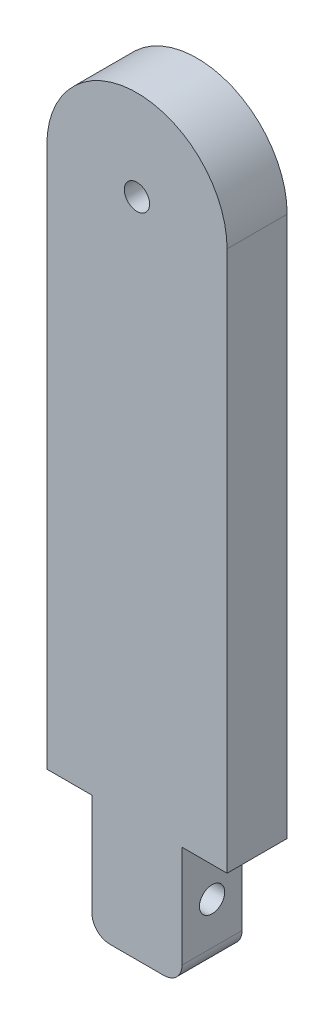
ISO-10303-21;
HEADER;
FILE_DESCRIPTION(('STEP AP214'),'2;1');
FILE_NAME('part.step','',(''),(''),'','','');
FILE_SCHEMA(('AUTOMOTIVE_DESIGN { 1 0 10303 214 1 1 1 1 }'));
ENDSEC;
DATA;
#1=APPLICATION_CONTEXT('core data for automotive mechanical design processes');
#2=APPLICATION_PROTOCOL_DEFINITION('international standard','automotive_design',2000,#1);
#3=PRODUCT_CONTEXT('',#1,'mechanical');
#4=PRODUCT('Part','Part','',(#3));
#5=PRODUCT_RELATED_PRODUCT_CATEGORY('part','',(#4));
#6=PRODUCT_DEFINITION_FORMATION('','',#4);
#7=PRODUCT_DEFINITION_CONTEXT('part definition',#1,'design');
#8=PRODUCT_DEFINITION('design','',#6,#7);
#9=PRODUCT_DEFINITION_SHAPE('','',#8);
#10=(LENGTH_UNIT() NAMED_UNIT(*) SI_UNIT(.MILLI.,.METRE.));
#11=(NAMED_UNIT(*) PLANE_ANGLE_UNIT() SI_UNIT($,.RADIAN.));
#12=(NAMED_UNIT(*) SI_UNIT($,.STERADIAN.) SOLID_ANGLE_UNIT());
#13=UNCERTAINTY_MEASURE_WITH_UNIT(LENGTH_MEASURE(1.E-05),#10,'distance_accuracy_value','');
#14=(GEOMETRIC_REPRESENTATION_CONTEXT(3) GLOBAL_UNCERTAINTY_ASSIGNED_CONTEXT((#13)) GLOBAL_UNIT_ASSIGNED_CONTEXT((#10,
#11,#12)) REPRESENTATION_CONTEXT('',''));
#15=CARTESIAN_POINT('',(0.,0.,0.));
#16=DIRECTION('',(0.,0.,1.));
#17=DIRECTION('',(1.,0.,0.));
#18=AXIS2_PLACEMENT_3D('',#15,#16,#17);
#19=CARTESIAN_POINT('',(15.,110.,0.));
#20=DIRECTION('',(0.,0.,-1.));
#21=DIRECTION('',(-1.,0.,0.));
#22=AXIS2_PLACEMENT_3D('',#19,#20,#21);
#23=CYLINDRICAL_SURFACE('',#22,15.);
#24=DIRECTION('',(0.,0.,-1.));
#25=VECTOR('',#24,1.);
#26=CARTESIAN_POINT('',(30.,110.,10.));
#27=LINE('',#26,#25);
#28=CARTESIAN_POINT('',(30.,110.,0.));
#29=VERTEX_POINT('',#28);
#30=CARTESIAN_POINT('',(30.,110.,10.));
#31=VERTEX_POINT('',#30);
#32=EDGE_CURVE('E196',#29,#31,#27,.F.);
#33=ORIENTED_EDGE('',*,*,#32,.F.);
#34=CARTESIAN_POINT('',(15.,110.,0.));
#35=DIRECTION('',(0.,0.,-1.));
#36=DIRECTION('',(-1.,0.,0.));
#37=AXIS2_PLACEMENT_3D('',#34,#35,#36);
#38=CIRCLE('',#37,15.);
#39=CARTESIAN_POINT('',(0.,110.,0.));
#40=VERTEX_POINT('',#39);
#41=EDGE_CURVE('E51',#40,#29,#38,.T.);
#42=ORIENTED_EDGE('',*,*,#41,.F.);
#43=DIRECTION('',(0.,0.,-1.));
#44=VECTOR('',#43,1.);
#45=CARTESIAN_POINT('',(0.,110.,10.));
#46=LINE('',#45,#44);
#47=CARTESIAN_POINT('',(0.,110.,10.));
#48=VERTEX_POINT('',#47);
#49=EDGE_CURVE('E122',#48,#40,#46,.T.);
#50=ORIENTED_EDGE('',*,*,#49,.F.);
#51=CARTESIAN_POINT('',(15.,110.,10.));
#52=DIRECTION('',(0.,0.,-1.));
#53=DIRECTION('',(-1.,0.,0.));
#54=AXIS2_PLACEMENT_3D('',#51,#52,#53);
#55=CIRCLE('',#54,15.);
#56=EDGE_CURVE('E11',#31,#48,#55,.F.);
#57=ORIENTED_EDGE('',*,*,#56,.F.);
#58=EDGE_LOOP('',(#33,#42,#50,#57));
#59=FACE_BOUND('',#58,.T.);
#60=ADVANCED_FACE('F43',(#59),#23,.T.);
#61=CARTESIAN_POINT('',(0.,0.,10.));
#62=DIRECTION('',(1.,0.,0.));
#63=DIRECTION('',(0.,0.,-1.));
#64=AXIS2_PLACEMENT_3D('',#61,#62,#63);
#65=PLANE('',#64);
#66=DIRECTION('',(0.,-1.,0.));
#67=VECTOR('',#66,1.);
#68=CARTESIAN_POINT('',(0.,0.,10.));
#69=LINE('',#68,#67);
#70=CARTESIAN_POINT('',(0.,20.,10.));
#71=VERTEX_POINT('',#70);
#72=EDGE_CURVE('E166',#48,#71,#69,.T.);
#73=ORIENTED_EDGE('',*,*,#72,.F.);
#74=ORIENTED_EDGE('',*,*,#49,.T.);
#75=DIRECTION('',(0.,-1.,0.));
#76=VECTOR('',#75,1.);
#77=CARTESIAN_POINT('',(0.,0.,0.));
#78=LINE('',#77,#76);
#79=CARTESIAN_POINT('',(0.,20.,0.));
#80=VERTEX_POINT('',#79);
#81=EDGE_CURVE('E117',#40,#80,#78,.T.);
#82=ORIENTED_EDGE('',*,*,#81,.T.);
#83=DIRECTION('',(0.,0.,1.));
#84=VECTOR('',#83,1.);
#85=CARTESIAN_POINT('',(0.,20.,0.));
#86=LINE('',#85,#84);
#87=EDGE_CURVE('E121',#80,#71,#86,.T.);
#88=ORIENTED_EDGE('',*,*,#87,.T.);
#89=EDGE_LOOP('',(#73,#74,#82,#88));
#90=FACE_BOUND('',#89,.T.);
#91=ADVANCED_FACE('F120',(#90),#65,.F.);
#92=CARTESIAN_POINT('',(0.,0.,10.));
#93=DIRECTION('',(0.,1.,0.));
#94=DIRECTION('',(0.,0.,1.));
#95=AXIS2_PLACEMENT_3D('',#92,#93,#94);
#96=PLANE('',#95);
#97=DIRECTION('',(1.,0.,0.));
#98=VECTOR('',#97,1.);
#99=CARTESIAN_POINT('',(0.,0.,0.));
#100=LINE('',#99,#98);
#101=CARTESIAN_POINT('',(10.5,0.,0.));
#102=VERTEX_POINT('',#101);
#103=CARTESIAN_POINT('',(19.5,0.,0.));
#104=VERTEX_POINT('',#103);
#105=EDGE_CURVE('E125',#102,#104,#100,.T.);
#106=ORIENTED_EDGE('',*,*,#105,.T.);
#107=DIRECTION('',(0.,0.,1.));
#108=VECTOR('',#107,1.);
#109=CARTESIAN_POINT('',(19.5,0.,10.));
#110=LINE('',#109,#108);
#111=CARTESIAN_POINT('',(19.5,0.,10.));
#112=VERTEX_POINT('',#111);
#113=EDGE_CURVE('E180',#104,#112,#110,.T.);
#114=ORIENTED_EDGE('',*,*,#113,.T.);
#115=DIRECTION('',(1.,0.,0.));
#116=VECTOR('',#115,1.);
#117=CARTESIAN_POINT('',(0.,0.,10.));
#118=LINE('',#117,#116);
#119=CARTESIAN_POINT('',(10.5,0.,10.));
#120=VERTEX_POINT('',#119);
#121=EDGE_CURVE('E168',#120,#112,#118,.T.);
#122=ORIENTED_EDGE('',*,*,#121,.F.);
#123=DIRECTION('',(0.,0.,1.));
#124=VECTOR('',#123,1.);
#125=CARTESIAN_POINT('',(10.5,0.,10.));
#126=LINE('',#125,#124);
#127=EDGE_CURVE('E173',#120,#102,#126,.F.);
#128=ORIENTED_EDGE('',*,*,#127,.T.);
#129=EDGE_LOOP('',(#106,#114,#122,#128));
#130=FACE_BOUND('',#129,.T.);
#131=ADVANCED_FACE('F224',(#130),#96,.F.);
#132=CARTESIAN_POINT('',(30.,0.,10.));
#133=DIRECTION('',(-1.,0.,0.));
#134=DIRECTION('',(0.,0.,1.));
#135=AXIS2_PLACEMENT_3D('',#132,#133,#134);
#136=PLANE('',#135);
#137=DIRECTION('',(0.,1.,0.));
#138=VECTOR('',#137,1.);
#139=CARTESIAN_POINT('',(30.,0.,0.));
#140=LINE('',#139,#138);
#141=CARTESIAN_POINT('',(30.,20.,0.));
#142=VERTEX_POINT('',#141);
#143=EDGE_CURVE('E169',#142,#29,#140,.T.);
#144=ORIENTED_EDGE('',*,*,#143,.T.);
#145=ORIENTED_EDGE('',*,*,#32,.T.);
#146=DIRECTION('',(0.,1.,0.));
#147=VECTOR('',#146,1.);
#148=CARTESIAN_POINT('',(30.,0.,10.));
#149=LINE('',#148,#147);
#150=CARTESIAN_POINT('',(30.,20.,10.));
#151=VERTEX_POINT('',#150);
#152=EDGE_CURVE('E172',#151,#31,#149,.T.);
#153=ORIENTED_EDGE('',*,*,#152,.F.);
#154=DIRECTION('',(0.,0.,1.));
#155=VECTOR('',#154,1.);
#156=CARTESIAN_POINT('',(30.,20.,0.));
#157=LINE('',#156,#155);
#158=EDGE_CURVE('E157',#142,#151,#157,.T.);
#159=ORIENTED_EDGE('',*,*,#158,.F.);
#160=EDGE_LOOP('',(#144,#145,#153,#159));
#161=FACE_BOUND('',#160,.T.);
#162=ADVANCED_FACE('F207',(#161),#136,.F.);
#163=CARTESIAN_POINT('',(0.,0.,10.));
#164=DIRECTION('',(0.,0.,-1.));
#165=DIRECTION('',(-1.,0.,0.));
#166=AXIS2_PLACEMENT_3D('',#163,#164,#165);
#167=PLANE('',#166);
#168=CARTESIAN_POINT('',(15.,110.,10.));
#169=DIRECTION('',(0.,0.,-1.));
#170=DIRECTION('',(-1.,0.,0.));
#171=AXIS2_PLACEMENT_3D('',#168,#169,#170);
#172=CIRCLE('',#171,2.1);
#173=CARTESIAN_POINT('',(12.9,110.,10.));
#174=VERTEX_POINT('',#173);
#175=EDGE_CURVE('E200',#174,#174,#172,.T.);
#176=ORIENTED_EDGE('',*,*,#175,.T.);
#177=EDGE_LOOP('',(#176));
#178=FACE_BOUND('',#177,.T.);
#179=ORIENTED_EDGE('',*,*,#152,.T.);
#180=ORIENTED_EDGE('',*,*,#56,.T.);
#181=ORIENTED_EDGE('',*,*,#72,.T.);
#182=DIRECTION('',(-1.,0.,0.));
#183=VECTOR('',#182,1.);
#184=CARTESIAN_POINT('',(0.,20.,10.));
#185=LINE('',#184,#183);
#186=CARTESIAN_POINT('',(7.5,20.,10.));
#187=VERTEX_POINT('',#186);
#188=EDGE_CURVE('E135',#187,#71,#185,.T.);
#189=ORIENTED_EDGE('',*,*,#188,.F.);
#190=DIRECTION('',(0.,1.,0.));
#191=VECTOR('',#190,1.);
#192=CARTESIAN_POINT('',(7.5,20.,10.));
#193=LINE('',#192,#191);
#194=CARTESIAN_POINT('',(7.49999999999999,3.,10.));
#195=VERTEX_POINT('',#194);
#196=EDGE_CURVE('E146',#195,#187,#193,.T.);
#197=ORIENTED_EDGE('',*,*,#196,.F.);
#198=CARTESIAN_POINT('',(10.5,3.,10.));
#199=DIRECTION('',(0.,0.,-1.));
#200=DIRECTION('',(-1.,0.,0.));
#201=AXIS2_PLACEMENT_3D('',#198,#199,#200);
#202=CIRCLE('',#201,3.);
#203=EDGE_CURVE('E183',#195,#120,#202,.F.);
#204=ORIENTED_EDGE('',*,*,#203,.T.);
#205=ORIENTED_EDGE('',*,*,#121,.T.);
#206=CARTESIAN_POINT('',(19.5,3.,10.));
#207=DIRECTION('',(0.,0.,-1.));
#208=DIRECTION('',(-1.,0.,0.));
#209=AXIS2_PLACEMENT_3D('',#206,#207,#208);
#210=CIRCLE('',#209,3.);
#211=CARTESIAN_POINT('',(22.5,3.,10.));
#212=VERTEX_POINT('',#211);
#213=EDGE_CURVE('E185',#112,#212,#210,.F.);
#214=ORIENTED_EDGE('',*,*,#213,.T.);
#215=DIRECTION('',(0.,-1.,0.));
#216=VECTOR('',#215,1.);
#217=CARTESIAN_POINT('',(22.5,20.,10.));
#218=LINE('',#217,#216);
#219=CARTESIAN_POINT('',(22.5,20.,10.));
#220=VERTEX_POINT('',#219);
#221=EDGE_CURVE('E154',#220,#212,#218,.T.);
#222=ORIENTED_EDGE('',*,*,#221,.F.);
#223=DIRECTION('',(-1.,0.,0.));
#224=VECTOR('',#223,1.);
#225=CARTESIAN_POINT('',(30.,20.,10.));
#226=LINE('',#225,#224);
#227=EDGE_CURVE('E158',#151,#220,#226,.T.);
#228=ORIENTED_EDGE('',*,*,#227,.F.);
#229=EDGE_LOOP('',(#179,#180,#181,#189,#197,#204,#205,#214,#222,#228));
#230=FACE_BOUND('',#229,.T.);
#231=ADVANCED_FACE('F213',(#178,#230),#167,.F.);
#232=CARTESIAN_POINT('',(0.,0.,0.));
#233=DIRECTION('',(0.,0.,-1.));
#234=DIRECTION('',(-1.,0.,0.));
#235=AXIS2_PLACEMENT_3D('',#232,#233,#234);
#236=PLANE('',#235);
#237=CARTESIAN_POINT('',(15.,110.,0.));
#238=DIRECTION('',(0.,0.,-1.));
#239=DIRECTION('',(-1.,0.,0.));
#240=AXIS2_PLACEMENT_3D('',#237,#238,#239);
#241=CIRCLE('',#240,2.1);
#242=CARTESIAN_POINT('',(12.9,110.,0.));
#243=VERTEX_POINT('',#242);
#244=EDGE_CURVE('E274',#243,#243,#241,.T.);
#245=ORIENTED_EDGE('',*,*,#244,.F.);
#246=EDGE_LOOP('',(#245));
#247=FACE_BOUND('',#246,.T.);
#248=ORIENTED_EDGE('',*,*,#81,.F.);
#249=ORIENTED_EDGE('',*,*,#41,.T.);
#250=ORIENTED_EDGE('',*,*,#143,.F.);
#251=DIRECTION('',(-1.,0.,0.));
#252=VECTOR('',#251,1.);
#253=CARTESIAN_POINT('',(30.,20.,0.));
#254=LINE('',#253,#252);
#255=CARTESIAN_POINT('',(22.5,20.,0.));
#256=VERTEX_POINT('',#255);
#257=EDGE_CURVE('E150',#142,#256,#254,.T.);
#258=ORIENTED_EDGE('',*,*,#257,.T.);
#259=DIRECTION('',(0.,-1.,0.));
#260=VECTOR('',#259,1.);
#261=CARTESIAN_POINT('',(22.5,20.,0.));
#262=LINE('',#261,#260);
#263=CARTESIAN_POINT('',(22.5,3.,0.));
#264=VERTEX_POINT('',#263);
#265=EDGE_CURVE('E153',#256,#264,#262,.T.);
#266=ORIENTED_EDGE('',*,*,#265,.T.);
#267=CARTESIAN_POINT('',(19.5,3.,0.));
#268=DIRECTION('',(0.,0.,-1.));
#269=DIRECTION('',(-1.,0.,0.));
#270=AXIS2_PLACEMENT_3D('',#267,#268,#269);
#271=CIRCLE('',#270,3.);
#272=EDGE_CURVE('E191',#264,#104,#271,.T.);
#273=ORIENTED_EDGE('',*,*,#272,.T.);
#274=ORIENTED_EDGE('',*,*,#105,.F.);
#275=CARTESIAN_POINT('',(10.5,3.,0.));
#276=DIRECTION('',(0.,0.,-1.));
#277=DIRECTION('',(-1.,0.,0.));
#278=AXIS2_PLACEMENT_3D('',#275,#276,#277);
#279=CIRCLE('',#278,3.);
#280=CARTESIAN_POINT('',(7.49999999999999,3.,0.));
#281=VERTEX_POINT('',#280);
#282=EDGE_CURVE('E189',#102,#281,#279,.T.);
#283=ORIENTED_EDGE('',*,*,#282,.T.);
#284=DIRECTION('',(0.,1.,0.));
#285=VECTOR('',#284,1.);
#286=CARTESIAN_POINT('',(7.5,20.,0.));
#287=LINE('',#286,#285);
#288=CARTESIAN_POINT('',(7.5,20.,0.));
#289=VERTEX_POINT('',#288);
#290=EDGE_CURVE('E140',#281,#289,#287,.T.);
#291=ORIENTED_EDGE('',*,*,#290,.T.);
#292=DIRECTION('',(-1.,0.,0.));
#293=VECTOR('',#292,1.);
#294=CARTESIAN_POINT('',(0.,20.,0.));
#295=LINE('',#294,#293);
#296=EDGE_CURVE('E132',#289,#80,#295,.T.);
#297=ORIENTED_EDGE('',*,*,#296,.T.);
#298=EDGE_LOOP('',(#248,#249,#250,#258,#266,#273,#274,#283,#291,#297));
#299=FACE_BOUND('',#298,.T.);
#300=ADVANCED_FACE('F138',(#247,#299),#236,.T.);
#301=CARTESIAN_POINT('',(22.5,20.,0.));
#302=DIRECTION('',(-1.,0.,0.));
#303=DIRECTION('',(0.,-1.,0.));
#304=AXIS2_PLACEMENT_3D('',#301,#302,#303);
#305=PLANE('',#304);
#306=CARTESIAN_POINT('',(22.5,10.,5.00000000000001));
#307=DIRECTION('',(-1.,0.,0.));
#308=DIRECTION('',(0.,-1.,0.));
#309=AXIS2_PLACEMENT_3D('',#306,#307,#308);
#310=CIRCLE('',#309,2.1);
#311=CARTESIAN_POINT('',(22.5,10.,7.10000000000001));
#312=VERTEX_POINT('',#311);
#313=EDGE_CURVE('E161',#312,#312,#310,.T.);
#314=ORIENTED_EDGE('',*,*,#313,.T.);
#315=EDGE_LOOP('',(#314));
#316=FACE_BOUND('',#315,.T.);
#317=ORIENTED_EDGE('',*,*,#221,.T.);
#318=DIRECTION('',(0.,0.,1.));
#319=VECTOR('',#318,1.);
#320=CARTESIAN_POINT('',(22.5,3.,0.));
#321=LINE('',#320,#319);
#322=EDGE_CURVE('E187',#212,#264,#321,.F.);
#323=ORIENTED_EDGE('',*,*,#322,.T.);
#324=ORIENTED_EDGE('',*,*,#265,.F.);
#325=DIRECTION('',(0.,0.,1.));
#326=VECTOR('',#325,1.);
#327=CARTESIAN_POINT('',(22.5,20.,0.));
#328=LINE('',#327,#326);
#329=EDGE_CURVE('E148',#256,#220,#328,.T.);
#330=ORIENTED_EDGE('',*,*,#329,.T.);
#331=EDGE_LOOP('',(#317,#323,#324,#330));
#332=FACE_BOUND('',#331,.T.);
#333=ADVANCED_FACE('F216',(#316,#332),#305,.F.);
#334=CARTESIAN_POINT('',(30.,20.,0.));
#335=DIRECTION('',(0.,1.,0.));
#336=DIRECTION('',(-1.,0.,0.));
#337=AXIS2_PLACEMENT_3D('',#334,#335,#336);
#338=PLANE('',#337);
#339=ORIENTED_EDGE('',*,*,#227,.T.);
#340=ORIENTED_EDGE('',*,*,#329,.F.);
#341=ORIENTED_EDGE('',*,*,#257,.F.);
#342=ORIENTED_EDGE('',*,*,#158,.T.);
#343=EDGE_LOOP('',(#339,#340,#341,#342));
#344=FACE_BOUND('',#343,.T.);
#345=ADVANCED_FACE('F210',(#344),#338,.F.);
#346=CARTESIAN_POINT('',(0.,20.,0.));
#347=DIRECTION('',(0.,1.,0.));
#348=DIRECTION('',(-1.,0.,0.));
#349=AXIS2_PLACEMENT_3D('',#346,#347,#348);
#350=PLANE('',#349);
#351=ORIENTED_EDGE('',*,*,#188,.T.);
#352=ORIENTED_EDGE('',*,*,#87,.F.);
#353=ORIENTED_EDGE('',*,*,#296,.F.);
#354=DIRECTION('',(0.,0.,1.));
#355=VECTOR('',#354,1.);
#356=CARTESIAN_POINT('',(7.5,20.,0.));
#357=LINE('',#356,#355);
#358=EDGE_CURVE('E136',#289,#187,#357,.T.);
#359=ORIENTED_EDGE('',*,*,#358,.T.);
#360=EDGE_LOOP('',(#351,#352,#353,#359));
#361=FACE_BOUND('',#360,.T.);
#362=ADVANCED_FACE('F130',(#361),#350,.F.);
#363=CARTESIAN_POINT('',(7.5,20.,0.));
#364=DIRECTION('',(1.,0.,0.));
#365=DIRECTION('',(0.,1.,0.));
#366=AXIS2_PLACEMENT_3D('',#363,#364,#365);
#367=PLANE('',#366);
#368=CARTESIAN_POINT('',(7.5,10.,5.00000000000001));
#369=DIRECTION('',(1.,0.,0.));
#370=DIRECTION('',(0.,1.,0.));
#371=AXIS2_PLACEMENT_3D('',#368,#369,#370);
#372=CIRCLE('',#371,2.1);
#373=CARTESIAN_POINT('',(7.49999999999999,10.,7.10000000000001));
#374=VERTEX_POINT('',#373);
#375=EDGE_CURVE('E197',#374,#374,#372,.T.);
#376=ORIENTED_EDGE('',*,*,#375,.T.);
#377=EDGE_LOOP('',(#376));
#378=FACE_BOUND('',#377,.T.);
#379=ORIENTED_EDGE('',*,*,#290,.F.);
#380=DIRECTION('',(0.,0.,1.));
#381=VECTOR('',#380,1.);
#382=CARTESIAN_POINT('',(7.49999999999999,3.,0.));
#383=LINE('',#382,#381);
#384=EDGE_CURVE('E193',#281,#195,#383,.T.);
#385=ORIENTED_EDGE('',*,*,#384,.T.);
#386=ORIENTED_EDGE('',*,*,#196,.T.);
#387=ORIENTED_EDGE('',*,*,#358,.F.);
#388=EDGE_LOOP('',(#379,#385,#386,#387));
#389=FACE_BOUND('',#388,.T.);
#390=ADVANCED_FACE('F231',(#378,#389),#367,.F.);
#391=CARTESIAN_POINT('',(19.5,3.,10.));
#392=DIRECTION('',(0.,0.,1.));
#393=DIRECTION('',(1.,0.,0.));
#394=AXIS2_PLACEMENT_3D('',#391,#392,#393);
#395=CYLINDRICAL_SURFACE('',#394,3.);
#396=ORIENTED_EDGE('',*,*,#272,.F.);
#397=ORIENTED_EDGE('',*,*,#322,.F.);
#398=ORIENTED_EDGE('',*,*,#213,.F.);
#399=ORIENTED_EDGE('',*,*,#113,.F.);
#400=EDGE_LOOP('',(#396,#397,#398,#399));
#401=FACE_BOUND('',#400,.T.);
#402=ADVANCED_FACE('F219',(#401),#395,.T.);
#403=CARTESIAN_POINT('',(10.5,3.,0.));
#404=DIRECTION('',(0.,0.,1.));
#405=DIRECTION('',(1.,0.,0.));
#406=AXIS2_PLACEMENT_3D('',#403,#404,#405);
#407=CYLINDRICAL_SURFACE('',#406,3.);
#408=ORIENTED_EDGE('',*,*,#282,.F.);
#409=ORIENTED_EDGE('',*,*,#127,.F.);
#410=ORIENTED_EDGE('',*,*,#203,.F.);
#411=ORIENTED_EDGE('',*,*,#384,.F.);
#412=EDGE_LOOP('',(#408,#409,#410,#411));
#413=FACE_BOUND('',#412,.T.);
#414=ADVANCED_FACE('F228',(#413),#407,.T.);
#415=CARTESIAN_POINT('',(30.,10.,5.00000000000001));
#416=DIRECTION('',(-1.,0.,0.));
#417=DIRECTION('',(0.,0.,1.));
#418=AXIS2_PLACEMENT_3D('',#415,#416,#417);
#419=CYLINDRICAL_SURFACE('',#418,2.1);
#420=CARTESIAN_POINT('',(7.49999999999999,10.,7.10000000000001));
#421=CARTESIAN_POINT('',(7.65624999999999,10.,7.10000000000001));
#422=CARTESIAN_POINT('',(7.81249999999999,10.,7.10000000000001));
#423=CARTESIAN_POINT('',(8.12499999999999,10.,7.10000000000001));
#424=CARTESIAN_POINT('',(8.28124999999999,10.,7.10000000000001));
#425=CARTESIAN_POINT('',(8.59374999999999,10.,7.10000000000001));
#426=CARTESIAN_POINT('',(8.74999999999999,10.,7.10000000000001));
#427=CARTESIAN_POINT('',(9.06249999999999,10.,7.10000000000001));
#428=CARTESIAN_POINT('',(9.21874999999999,10.,7.10000000000001));
#429=CARTESIAN_POINT('',(9.53124999999999,10.,7.10000000000001));
#430=CARTESIAN_POINT('',(9.68749999999999,10.,7.10000000000001));
#431=CARTESIAN_POINT('',(9.99999999999999,10.,7.10000000000001));
#432=CARTESIAN_POINT('',(10.15625,10.,7.10000000000001));
#433=CARTESIAN_POINT('',(10.46875,10.,7.10000000000001));
#434=CARTESIAN_POINT('',(10.625,10.,7.10000000000001));
#435=CARTESIAN_POINT('',(10.9375,10.,7.10000000000001));
#436=CARTESIAN_POINT('',(11.09375,10.,7.10000000000001));
#437=CARTESIAN_POINT('',(11.40625,10.,7.10000000000001));
#438=CARTESIAN_POINT('',(11.5625,10.,7.10000000000001));
#439=CARTESIAN_POINT('',(11.875,10.,7.10000000000001));
#440=CARTESIAN_POINT('',(12.03125,10.,7.10000000000001));
#441=CARTESIAN_POINT('',(12.34375,10.,7.10000000000001));
#442=CARTESIAN_POINT('',(12.5,10.,7.10000000000001));
#443=CARTESIAN_POINT('',(12.8125,10.,7.10000000000001));
#444=CARTESIAN_POINT('',(12.96875,10.,7.10000000000001));
#445=CARTESIAN_POINT('',(13.28125,10.,7.10000000000001));
#446=CARTESIAN_POINT('',(13.4375,10.,7.10000000000001));
#447=CARTESIAN_POINT('',(13.75,10.,7.10000000000001));
#448=CARTESIAN_POINT('',(13.90625,10.,7.10000000000001));
#449=CARTESIAN_POINT('',(14.21875,10.,7.10000000000001));
#450=CARTESIAN_POINT('',(14.375,10.,7.10000000000001));
#451=CARTESIAN_POINT('',(14.6875,10.,7.10000000000001));
#452=CARTESIAN_POINT('',(14.84375,10.,7.10000000000001));
#453=CARTESIAN_POINT('',(15.15625,10.,7.10000000000001));
#454=CARTESIAN_POINT('',(15.3125,10.,7.10000000000001));
#455=CARTESIAN_POINT('',(15.625,10.,7.10000000000001));
#456=CARTESIAN_POINT('',(15.78125,10.,7.10000000000001));
#457=CARTESIAN_POINT('',(16.09375,10.,7.10000000000001));
#458=CARTESIAN_POINT('',(16.25,10.,7.10000000000001));
#459=CARTESIAN_POINT('',(16.5625,10.,7.10000000000001));
#460=CARTESIAN_POINT('',(16.71875,10.,7.10000000000001));
#461=CARTESIAN_POINT('',(17.03125,10.,7.10000000000001));
#462=CARTESIAN_POINT('',(17.1875,10.,7.10000000000001));
#463=CARTESIAN_POINT('',(17.5,10.,7.10000000000001));
#464=CARTESIAN_POINT('',(17.65625,10.,7.10000000000001));
#465=CARTESIAN_POINT('',(17.96875,10.,7.10000000000001));
#466=CARTESIAN_POINT('',(18.125,10.,7.10000000000001));
#467=CARTESIAN_POINT('',(18.4375,10.,7.10000000000001));
#468=CARTESIAN_POINT('',(18.59375,10.,7.10000000000001));
#469=CARTESIAN_POINT('',(18.90625,10.,7.10000000000001));
#470=CARTESIAN_POINT('',(19.0625,10.,7.10000000000001));
#471=CARTESIAN_POINT('',(19.375,10.,7.10000000000001));
#472=CARTESIAN_POINT('',(19.53125,10.,7.10000000000001));
#473=CARTESIAN_POINT('',(19.84375,10.,7.10000000000001));
#474=CARTESIAN_POINT('',(20.,10.,7.10000000000001));
#475=CARTESIAN_POINT('',(20.3125,10.,7.10000000000001));
#476=CARTESIAN_POINT('',(20.46875,10.,7.10000000000001));
#477=CARTESIAN_POINT('',(20.78125,10.,7.10000000000001));
#478=CARTESIAN_POINT('',(20.9375,10.,7.10000000000001));
#479=CARTESIAN_POINT('',(21.25,10.,7.10000000000001));
#480=CARTESIAN_POINT('',(21.40625,10.,7.10000000000001));
#481=CARTESIAN_POINT('',(21.71875,10.,7.10000000000001));
#482=CARTESIAN_POINT('',(21.875,10.,7.10000000000001));
#483=CARTESIAN_POINT('',(22.1875,10.,7.10000000000001));
#484=CARTESIAN_POINT('',(22.34375,10.,7.10000000000001));
#485=CARTESIAN_POINT('',(22.5,10.,7.10000000000001));
#486=B_SPLINE_CURVE_WITH_KNOTS('',3,(#420,#421,#422,#423,#424,#425,#426,#427,#428,#429,#430,
#431,#432,#433,#434,#435,#436,#437,#438,#439,#440,#441,#442,#443,#444,#445,#446,#447,#448,#449,
#450,#451,#452,#453,#454,#455,#456,#457,#458,#459,#460,#461,#462,#463,#464,#465,#466,#467,#468,
#469,#470,#471,#472,#473,#474,#475,#476,#477,#478,#479,#480,#481,#482,#483,#484,#485),
.UNSPECIFIED.,.F.,.F.,(4,2,2,2,2,2,2,2,2,2,2,2,2,2,2,2,2,2,2,2,2,2,2,2,2,2,2,2,2,2,2,2,4),(0.,
0.46875,0.937500000000001,1.40625,1.875,2.34375,2.8125,3.28125,3.75,4.21875,4.6875,5.15625,
5.62500000000001,6.09375000000001,6.56250000000001,7.03125,7.50000000000001,7.96875,8.4375,
8.90625,9.37500000000001,9.84375000000001,10.3125,10.78125,11.25,11.71875,12.1875,12.65625,
13.125,13.59375,14.0625,14.53125,15.),.UNSPECIFIED.);
#487=EDGE_CURVE('BSEAM257',#374,#312,#486,.T.);
#488=ORIENTED_EDGE('',*,*,#375,.F.);
#489=ORIENTED_EDGE('',*,*,#313,.F.);
#490=ORIENTED_EDGE('',*,*,#487,.T.);
#491=ORIENTED_EDGE('',*,*,#487,.F.);
#492=EDGE_LOOP('',(#488,#490,#489,#491));
#493=FACE_BOUND('',#492,.T.);
#494=ADVANCED_FACE('F257',(#493),#419,.F.);
#495=CARTESIAN_POINT('',(15.,110.,10.));
#496=DIRECTION('',(0.,0.,-1.));
#497=DIRECTION('',(-1.,0.,0.));
#498=AXIS2_PLACEMENT_3D('',#495,#496,#497);
#499=CYLINDRICAL_SURFACE('',#498,2.1);
#500=ORIENTED_EDGE('',*,*,#175,.F.);
#501=EDGE_LOOP('',(#500));
#502=FACE_BOUND('',#501,.T.);
#503=ORIENTED_EDGE('',*,*,#244,.T.);
#504=EDGE_LOOP('',(#503));
#505=FACE_BOUND('',#504,.T.);
#506=ADVANCED_FACE('F260',(#502,#505),#499,.F.);
#507=CLOSED_SHELL('',(#60,#91,#131,#162,#231,#300,#333,#345,#362,#390,#402,#414,#494,#506));
#508=MANIFOLD_SOLID_BREP('B2',#507);
#509=ADVANCED_BREP_SHAPE_REPRESENTATION('',(#18,#508),#14);
#510=SHAPE_DEFINITION_REPRESENTATION(#9,#509);
ENDSEC;
END-ISO-10303-21;
